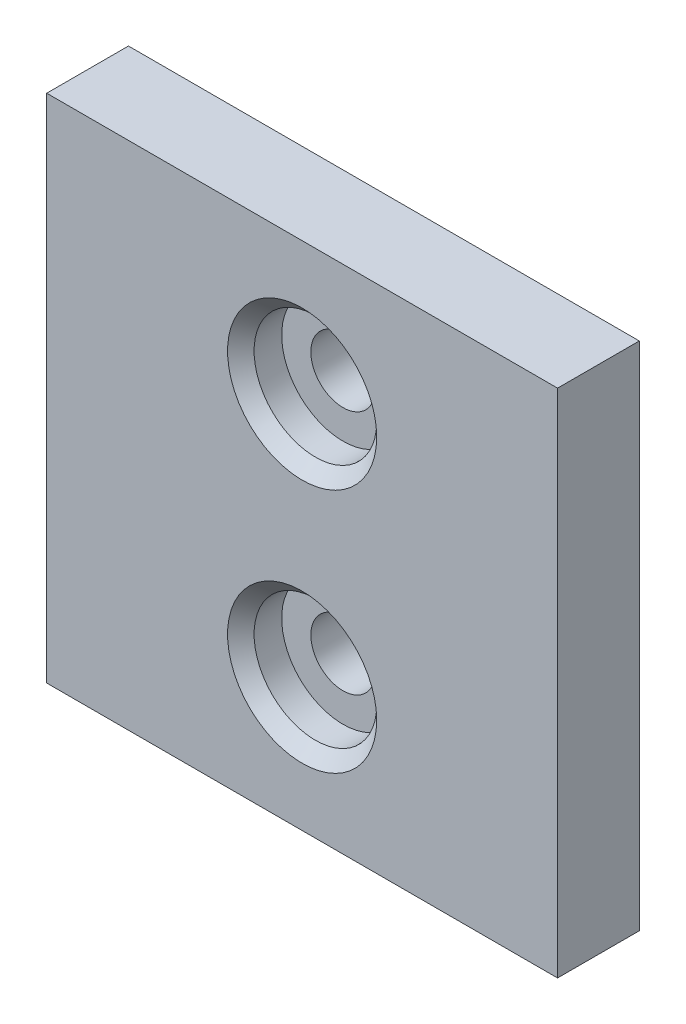
ISO-10303-21;
HEADER;
FILE_DESCRIPTION(('STEP AP214'),'2;1');
FILE_NAME('part.step','',(''),(''),'','','');
FILE_SCHEMA(('AUTOMOTIVE_DESIGN { 1 0 10303 214 1 1 1 1 }'));
ENDSEC;
DATA;
#1=APPLICATION_CONTEXT('core data for automotive mechanical design processes');
#2=APPLICATION_PROTOCOL_DEFINITION('international standard','automotive_design',2000,#1);
#3=PRODUCT_CONTEXT('',#1,'mechanical');
#4=PRODUCT('Part','Part','',(#3));
#5=PRODUCT_RELATED_PRODUCT_CATEGORY('part','',(#4));
#6=PRODUCT_DEFINITION_FORMATION('','',#4);
#7=PRODUCT_DEFINITION_CONTEXT('part definition',#1,'design');
#8=PRODUCT_DEFINITION('design','',#6,#7);
#9=PRODUCT_DEFINITION_SHAPE('','',#8);
#10=(LENGTH_UNIT() NAMED_UNIT(*) SI_UNIT(.MILLI.,.METRE.));
#11=(NAMED_UNIT(*) PLANE_ANGLE_UNIT() SI_UNIT($,.RADIAN.));
#12=(NAMED_UNIT(*) SI_UNIT($,.STERADIAN.) SOLID_ANGLE_UNIT());
#13=UNCERTAINTY_MEASURE_WITH_UNIT(LENGTH_MEASURE(1.E-05),#10,'distance_accuracy_value','');
#14=(GEOMETRIC_REPRESENTATION_CONTEXT(3) GLOBAL_UNCERTAINTY_ASSIGNED_CONTEXT((#13)) GLOBAL_UNIT_ASSIGNED_CONTEXT((#10,
#11,#12)) REPRESENTATION_CONTEXT('',''));
#15=CARTESIAN_POINT('',(0.,0.,0.));
#16=DIRECTION('',(0.,0.,1.));
#17=DIRECTION('',(1.,0.,0.));
#18=AXIS2_PLACEMENT_3D('',#15,#16,#17);
#19=CARTESIAN_POINT('',(25.,25.,8.));
#20=DIRECTION('',(-1.,0.,0.));
#21=DIRECTION('',(0.,-1.,0.));
#22=AXIS2_PLACEMENT_3D('',#19,#20,#21);
#23=PLANE('',#22);
#24=DIRECTION('',(0.,1.,0.));
#25=VECTOR('',#24,1.);
#26=CARTESIAN_POINT('',(25.,25.,0.));
#27=LINE('',#26,#25);
#28=CARTESIAN_POINT('',(25.,-25.,0.));
#29=VERTEX_POINT('',#28);
#30=CARTESIAN_POINT('',(25.,25.,0.));
#31=VERTEX_POINT('',#30);
#32=EDGE_CURVE('E96',#29,#31,#27,.T.);
#33=ORIENTED_EDGE('',*,*,#32,.T.);
#34=DIRECTION('',(0.,0.,-1.));
#35=VECTOR('',#34,1.);
#36=CARTESIAN_POINT('',(25.,25.,8.));
#37=LINE('',#36,#35);
#38=CARTESIAN_POINT('',(25.,25.,8.));
#39=VERTEX_POINT('',#38);
#40=EDGE_CURVE('E11',#39,#31,#37,.T.);
#41=ORIENTED_EDGE('',*,*,#40,.F.);
#42=DIRECTION('',(0.,1.,0.));
#43=VECTOR('',#42,1.);
#44=CARTESIAN_POINT('',(25.,25.,8.));
#45=LINE('',#44,#43);
#46=CARTESIAN_POINT('',(25.,-25.,8.));
#47=VERTEX_POINT('',#46);
#48=EDGE_CURVE('E84',#47,#39,#45,.T.);
#49=ORIENTED_EDGE('',*,*,#48,.F.);
#50=DIRECTION('',(0.,0.,-1.));
#51=VECTOR('',#50,1.);
#52=CARTESIAN_POINT('',(25.,-25.,8.));
#53=LINE('',#52,#51);
#54=EDGE_CURVE('E92',#47,#29,#53,.T.);
#55=ORIENTED_EDGE('',*,*,#54,.T.);
#56=EDGE_LOOP('',(#33,#41,#49,#55));
#57=FACE_BOUND('',#56,.T.);
#58=ADVANCED_FACE('F33',(#57),#23,.F.);
#59=CARTESIAN_POINT('',(-25.,25.,8.));
#60=DIRECTION('',(0.,-1.,0.));
#61=DIRECTION('',(0.,0.,-1.));
#62=AXIS2_PLACEMENT_3D('',#59,#60,#61);
#63=PLANE('',#62);
#64=DIRECTION('',(-1.,0.,0.));
#65=VECTOR('',#64,1.);
#66=CARTESIAN_POINT('',(-25.,25.,0.));
#67=LINE('',#66,#65);
#68=CARTESIAN_POINT('',(-25.,25.,0.));
#69=VERTEX_POINT('',#68);
#70=EDGE_CURVE('E88',#31,#69,#67,.T.);
#71=ORIENTED_EDGE('',*,*,#70,.T.);
#72=DIRECTION('',(0.,0.,-1.));
#73=VECTOR('',#72,1.);
#74=CARTESIAN_POINT('',(-25.,25.,8.));
#75=LINE('',#74,#73);
#76=CARTESIAN_POINT('',(-25.,25.,8.));
#77=VERTEX_POINT('',#76);
#78=EDGE_CURVE('E41',#77,#69,#75,.T.);
#79=ORIENTED_EDGE('',*,*,#78,.F.);
#80=DIRECTION('',(-1.,0.,0.));
#81=VECTOR('',#80,1.);
#82=CARTESIAN_POINT('',(-25.,25.,8.));
#83=LINE('',#82,#81);
#84=EDGE_CURVE('E79',#39,#77,#83,.T.);
#85=ORIENTED_EDGE('',*,*,#84,.F.);
#86=ORIENTED_EDGE('',*,*,#40,.T.);
#87=EDGE_LOOP('',(#71,#79,#85,#86));
#88=FACE_BOUND('',#87,.T.);
#89=ADVANCED_FACE('F87',(#88),#63,.F.);
#90=CARTESIAN_POINT('',(-25.,25.,8.));
#91=DIRECTION('',(1.,0.,0.));
#92=DIRECTION('',(0.,1.,0.));
#93=AXIS2_PLACEMENT_3D('',#90,#91,#92);
#94=PLANE('',#93);
#95=DIRECTION('',(0.,-1.,0.));
#96=VECTOR('',#95,1.);
#97=CARTESIAN_POINT('',(-25.,25.,0.));
#98=LINE('',#97,#96);
#99=CARTESIAN_POINT('',(-25.,-25.,0.));
#100=VERTEX_POINT('',#99);
#101=EDGE_CURVE('E66',#69,#100,#98,.T.);
#102=ORIENTED_EDGE('',*,*,#101,.T.);
#103=DIRECTION('',(0.,0.,-1.));
#104=VECTOR('',#103,1.);
#105=CARTESIAN_POINT('',(-25.,-25.,8.));
#106=LINE('',#105,#104);
#107=CARTESIAN_POINT('',(-25.,-25.,8.));
#108=VERTEX_POINT('',#107);
#109=EDGE_CURVE('E89',#108,#100,#106,.T.);
#110=ORIENTED_EDGE('',*,*,#109,.F.);
#111=DIRECTION('',(0.,-1.,0.));
#112=VECTOR('',#111,1.);
#113=CARTESIAN_POINT('',(-25.,25.,8.));
#114=LINE('',#113,#112);
#115=EDGE_CURVE('E82',#77,#108,#114,.T.);
#116=ORIENTED_EDGE('',*,*,#115,.F.);
#117=ORIENTED_EDGE('',*,*,#78,.T.);
#118=EDGE_LOOP('',(#102,#110,#116,#117));
#119=FACE_BOUND('',#118,.T.);
#120=ADVANCED_FACE('F90',(#119),#94,.F.);
#121=CARTESIAN_POINT('',(-25.,-25.,8.));
#122=DIRECTION('',(0.,1.,0.));
#123=DIRECTION('',(0.,0.,1.));
#124=AXIS2_PLACEMENT_3D('',#121,#122,#123);
#125=PLANE('',#124);
#126=DIRECTION('',(1.,0.,0.));
#127=VECTOR('',#126,1.);
#128=CARTESIAN_POINT('',(-25.,-25.,0.));
#129=LINE('',#128,#127);
#130=EDGE_CURVE('E72',#100,#29,#129,.T.);
#131=ORIENTED_EDGE('',*,*,#130,.T.);
#132=ORIENTED_EDGE('',*,*,#54,.F.);
#133=DIRECTION('',(1.,0.,0.));
#134=VECTOR('',#133,1.);
#135=CARTESIAN_POINT('',(-25.,-25.,8.));
#136=LINE('',#135,#134);
#137=EDGE_CURVE('E49',#108,#47,#136,.T.);
#138=ORIENTED_EDGE('',*,*,#137,.F.);
#139=ORIENTED_EDGE('',*,*,#109,.T.);
#140=EDGE_LOOP('',(#131,#132,#138,#139));
#141=FACE_BOUND('',#140,.T.);
#142=ADVANCED_FACE('F104',(#141),#125,.F.);
#143=CARTESIAN_POINT('',(0.,0.,8.));
#144=DIRECTION('',(0.,0.,1.));
#145=DIRECTION('',(1.,0.,0.));
#146=AXIS2_PLACEMENT_3D('',#143,#144,#145);
#147=PLANE('',#146);
#148=CARTESIAN_POINT('',(0.,12.,8.));
#149=DIRECTION('',(0.,0.,1.));
#150=DIRECTION('',(1.,0.,0.));
#151=AXIS2_PLACEMENT_3D('',#148,#149,#150);
#152=CIRCLE('',#151,7.2985);
#153=CARTESIAN_POINT('',(7.2985,12.,8.));
#154=VERTEX_POINT('',#153);
#155=EDGE_CURVE('E136',#154,#154,#152,.T.);
#156=ORIENTED_EDGE('',*,*,#155,.F.);
#157=EDGE_LOOP('',(#156));
#158=FACE_BOUND('',#157,.T.);
#159=CARTESIAN_POINT('',(0.,-12.,8.));
#160=DIRECTION('',(0.,0.,1.));
#161=DIRECTION('',(1.,0.,0.));
#162=AXIS2_PLACEMENT_3D('',#159,#160,#161);
#163=CIRCLE('',#162,7.2985);
#164=CARTESIAN_POINT('',(7.2985,-12.,8.));
#165=VERTEX_POINT('',#164);
#166=EDGE_CURVE('E121',#165,#165,#163,.T.);
#167=ORIENTED_EDGE('',*,*,#166,.F.);
#168=EDGE_LOOP('',(#167));
#169=FACE_BOUND('',#168,.T.);
#170=ORIENTED_EDGE('',*,*,#48,.T.);
#171=ORIENTED_EDGE('',*,*,#84,.T.);
#172=ORIENTED_EDGE('',*,*,#115,.T.);
#173=ORIENTED_EDGE('',*,*,#137,.T.);
#174=EDGE_LOOP('',(#170,#171,#172,#173));
#175=FACE_BOUND('',#174,.T.);
#176=ADVANCED_FACE('F80',(#158,#169,#175),#147,.T.);
#177=CARTESIAN_POINT('',(0.,0.,0.));
#178=DIRECTION('',(0.,0.,1.));
#179=DIRECTION('',(1.,0.,0.));
#180=AXIS2_PLACEMENT_3D('',#177,#178,#179);
#181=PLANE('',#180);
#182=CARTESIAN_POINT('',(0.,12.,0.));
#183=DIRECTION('',(0.,0.,1.));
#184=DIRECTION('',(1.,0.,0.));
#185=AXIS2_PLACEMENT_3D('',#182,#183,#184);
#186=CIRCLE('',#185,3.15);
#187=CARTESIAN_POINT('',(3.15,12.,0.));
#188=VERTEX_POINT('',#187);
#189=EDGE_CURVE('E124',#188,#188,#186,.T.);
#190=ORIENTED_EDGE('',*,*,#189,.T.);
#191=EDGE_LOOP('',(#190));
#192=FACE_BOUND('',#191,.T.);
#193=CARTESIAN_POINT('',(0.,-12.,0.));
#194=DIRECTION('',(0.,0.,1.));
#195=DIRECTION('',(1.,0.,0.));
#196=AXIS2_PLACEMENT_3D('',#193,#194,#195);
#197=CIRCLE('',#196,3.15);
#198=CARTESIAN_POINT('',(3.15,-12.,0.));
#199=VERTEX_POINT('',#198);
#200=EDGE_CURVE('E99',#199,#199,#197,.T.);
#201=ORIENTED_EDGE('',*,*,#200,.T.);
#202=EDGE_LOOP('',(#201));
#203=FACE_BOUND('',#202,.T.);
#204=ORIENTED_EDGE('',*,*,#32,.F.);
#205=ORIENTED_EDGE('',*,*,#130,.F.);
#206=ORIENTED_EDGE('',*,*,#101,.F.);
#207=ORIENTED_EDGE('',*,*,#70,.F.);
#208=EDGE_LOOP('',(#204,#205,#206,#207));
#209=FACE_BOUND('',#208,.T.);
#210=ADVANCED_FACE('F107',(#192,#203,#209),#181,.F.);
#211=CARTESIAN_POINT('',(0.,-12.,8.));
#212=DIRECTION('',(0.,0.,1.));
#213=DIRECTION('',(1.,0.,0.));
#214=AXIS2_PLACEMENT_3D('',#211,#212,#213);
#215=CYLINDRICAL_SURFACE('',#214,3.15000000000001);
#216=ORIENTED_EDGE('',*,*,#200,.F.);
#217=EDGE_LOOP('',(#216));
#218=FACE_BOUND('',#217,.T.);
#219=CARTESIAN_POINT('',(0.,-12.,4.00000000000001));
#220=DIRECTION('',(0.,0.,1.));
#221=DIRECTION('',(1.,0.,0.));
#222=AXIS2_PLACEMENT_3D('',#219,#220,#221);
#223=CIRCLE('',#222,3.15000000000001);
#224=CARTESIAN_POINT('',(3.15000000000001,-12.,4.00000000000001));
#225=VERTEX_POINT('',#224);
#226=EDGE_CURVE('E112',#225,#225,#223,.T.);
#227=ORIENTED_EDGE('',*,*,#226,.T.);
#228=EDGE_LOOP('',(#227));
#229=FACE_BOUND('',#228,.T.);
#230=ADVANCED_FACE('F176',(#218,#229),#215,.F.);
#231=CARTESIAN_POINT('',(5.99999999999999,-12.,4.00000000000001));
#232=DIRECTION('',(0.,0.,-1.));
#233=DIRECTION('',(-1.,0.,0.));
#234=AXIS2_PLACEMENT_3D('',#231,#232,#233);
#235=PLANE('',#234);
#236=ORIENTED_EDGE('',*,*,#226,.F.);
#237=EDGE_LOOP('',(#236));
#238=FACE_BOUND('',#237,.T.);
#239=CARTESIAN_POINT('',(0.,-12.,4.00000000000001));
#240=DIRECTION('',(0.,0.,1.));
#241=DIRECTION('',(1.,0.,0.));
#242=AXIS2_PLACEMENT_3D('',#239,#240,#241);
#243=CIRCLE('',#242,5.99999999999999);
#244=CARTESIAN_POINT('',(5.99999999999999,-12.,4.00000000000001));
#245=VERTEX_POINT('',#244);
#246=EDGE_CURVE('E115',#245,#245,#243,.T.);
#247=ORIENTED_EDGE('',*,*,#246,.T.);
#248=EDGE_LOOP('',(#247));
#249=FACE_BOUND('',#248,.T.);
#250=ADVANCED_FACE('F160',(#238,#249),#235,.F.);
#251=CARTESIAN_POINT('',(0.,-12.,8.));
#252=DIRECTION('',(0.,0.,1.));
#253=DIRECTION('',(1.,0.,0.));
#254=AXIS2_PLACEMENT_3D('',#251,#252,#253);
#255=CYLINDRICAL_SURFACE('',#254,5.99999999999999);
#256=ORIENTED_EDGE('',*,*,#246,.F.);
#257=EDGE_LOOP('',(#256));
#258=FACE_BOUND('',#257,.T.);
#259=CARTESIAN_POINT('',(0.,-12.,6.7015));
#260=DIRECTION('',(0.,0.,1.));
#261=DIRECTION('',(1.,0.,0.));
#262=AXIS2_PLACEMENT_3D('',#259,#260,#261);
#263=CIRCLE('',#262,5.99999999999999);
#264=CARTESIAN_POINT('',(5.99999999999999,-12.,6.7015));
#265=VERTEX_POINT('',#264);
#266=EDGE_CURVE('E118',#265,#265,#263,.T.);
#267=ORIENTED_EDGE('',*,*,#266,.T.);
#268=EDGE_LOOP('',(#267));
#269=FACE_BOUND('',#268,.T.);
#270=ADVANCED_FACE('F150',(#258,#269),#255,.F.);
#271=CARTESIAN_POINT('',(0.,-12.,8.));
#272=DIRECTION('',(0.,0.,1.));
#273=DIRECTION('',(1.,0.,0.));
#274=AXIS2_PLACEMENT_3D('',#271,#272,#273);
#275=CONICAL_SURFACE('',#274,7.2985,0.785398163397448);
#276=ORIENTED_EDGE('',*,*,#266,.F.);
#277=EDGE_LOOP('',(#276));
#278=FACE_BOUND('',#277,.T.);
#279=ORIENTED_EDGE('',*,*,#166,.T.);
#280=EDGE_LOOP('',(#279));
#281=FACE_BOUND('',#280,.T.);
#282=ADVANCED_FACE('F147',(#278,#281),#275,.F.);
#283=CARTESIAN_POINT('',(0.,12.,8.));
#284=DIRECTION('',(0.,0.,1.));
#285=DIRECTION('',(1.,0.,0.));
#286=AXIS2_PLACEMENT_3D('',#283,#284,#285);
#287=CYLINDRICAL_SURFACE('',#286,3.15000000000001);
#288=ORIENTED_EDGE('',*,*,#189,.F.);
#289=EDGE_LOOP('',(#288));
#290=FACE_BOUND('',#289,.T.);
#291=CARTESIAN_POINT('',(0.,12.,4.00000000000001));
#292=DIRECTION('',(0.,0.,1.));
#293=DIRECTION('',(1.,0.,0.));
#294=AXIS2_PLACEMENT_3D('',#291,#292,#293);
#295=CIRCLE('',#294,3.15000000000001);
#296=CARTESIAN_POINT('',(3.15000000000001,12.,4.00000000000001));
#297=VERTEX_POINT('',#296);
#298=EDGE_CURVE('E127',#297,#297,#295,.T.);
#299=ORIENTED_EDGE('',*,*,#298,.T.);
#300=EDGE_LOOP('',(#299));
#301=FACE_BOUND('',#300,.T.);
#302=ADVANCED_FACE('F149',(#290,#301),#287,.F.);
#303=CARTESIAN_POINT('',(5.99999999999999,12.,4.00000000000001));
#304=DIRECTION('',(0.,0.,-1.));
#305=DIRECTION('',(-1.,0.,0.));
#306=AXIS2_PLACEMENT_3D('',#303,#304,#305);
#307=PLANE('',#306);
#308=ORIENTED_EDGE('',*,*,#298,.F.);
#309=EDGE_LOOP('',(#308));
#310=FACE_BOUND('',#309,.T.);
#311=CARTESIAN_POINT('',(0.,12.,4.00000000000001));
#312=DIRECTION('',(0.,0.,1.));
#313=DIRECTION('',(1.,0.,0.));
#314=AXIS2_PLACEMENT_3D('',#311,#312,#313);
#315=CIRCLE('',#314,5.99999999999999);
#316=CARTESIAN_POINT('',(5.99999999999999,12.,4.00000000000001));
#317=VERTEX_POINT('',#316);
#318=EDGE_CURVE('E130',#317,#317,#315,.T.);
#319=ORIENTED_EDGE('',*,*,#318,.T.);
#320=EDGE_LOOP('',(#319));
#321=FACE_BOUND('',#320,.T.);
#322=ADVANCED_FACE('F157',(#310,#321),#307,.F.);
#323=CARTESIAN_POINT('',(0.,12.,8.));
#324=DIRECTION('',(0.,0.,1.));
#325=DIRECTION('',(1.,0.,0.));
#326=AXIS2_PLACEMENT_3D('',#323,#324,#325);
#327=CYLINDRICAL_SURFACE('',#326,5.99999999999999);
#328=ORIENTED_EDGE('',*,*,#318,.F.);
#329=EDGE_LOOP('',(#328));
#330=FACE_BOUND('',#329,.T.);
#331=CARTESIAN_POINT('',(0.,12.,6.7015));
#332=DIRECTION('',(0.,0.,1.));
#333=DIRECTION('',(1.,0.,0.));
#334=AXIS2_PLACEMENT_3D('',#331,#332,#333);
#335=CIRCLE('',#334,5.99999999999999);
#336=CARTESIAN_POINT('',(5.99999999999999,12.,6.7015));
#337=VERTEX_POINT('',#336);
#338=EDGE_CURVE('E133',#337,#337,#335,.T.);
#339=ORIENTED_EDGE('',*,*,#338,.T.);
#340=EDGE_LOOP('',(#339));
#341=FACE_BOUND('',#340,.T.);
#342=ADVANCED_FACE('F216',(#330,#341),#327,.F.);
#343=CARTESIAN_POINT('',(0.,12.,8.));
#344=DIRECTION('',(0.,0.,1.));
#345=DIRECTION('',(1.,0.,0.));
#346=AXIS2_PLACEMENT_3D('',#343,#344,#345);
#347=CONICAL_SURFACE('',#346,7.2985,0.785398163397448);
#348=ORIENTED_EDGE('',*,*,#338,.F.);
#349=EDGE_LOOP('',(#348));
#350=FACE_BOUND('',#349,.T.);
#351=ORIENTED_EDGE('',*,*,#155,.T.);
#352=EDGE_LOOP('',(#351));
#353=FACE_BOUND('',#352,.T.);
#354=ADVANCED_FACE('F140',(#350,#353),#347,.F.);
#355=CLOSED_SHELL('',(#58,#89,#120,#142,#176,#210,#230,#250,#270,#282,#302,#322,#342,#354));
#356=MANIFOLD_SOLID_BREP('B2',#355);
#357=ADVANCED_BREP_SHAPE_REPRESENTATION('',(#18,#356),#14);
#358=SHAPE_DEFINITION_REPRESENTATION(#9,#357);
ENDSEC;
END-ISO-10303-21;
